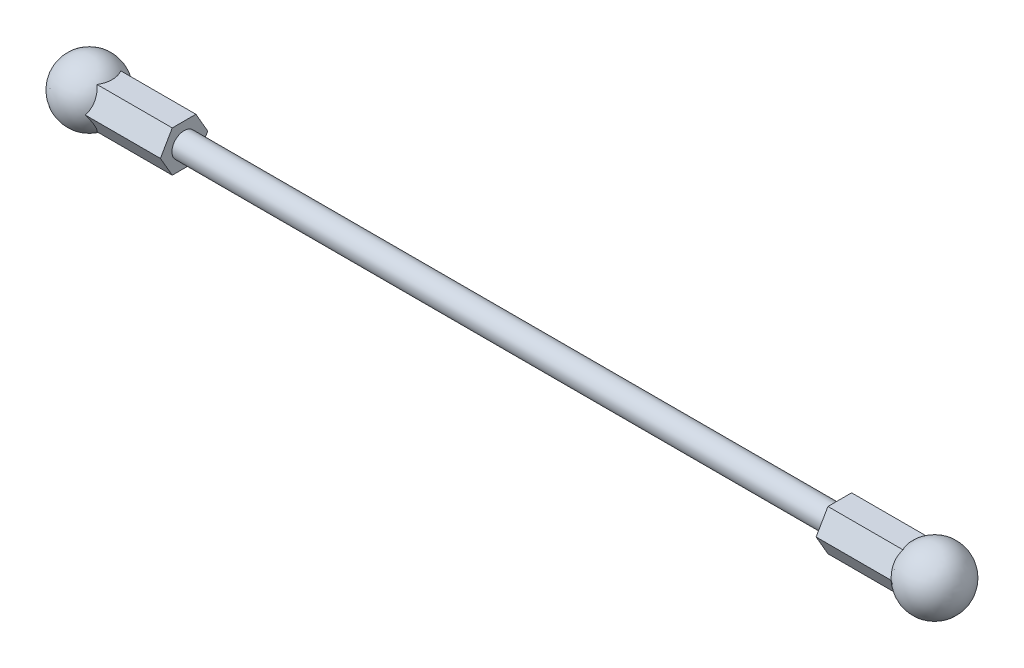
ISO-10303-21;
HEADER;
FILE_DESCRIPTION(('STEP AP214'),'2;1');
FILE_NAME('part.step','',(''),(''),'','','');
FILE_SCHEMA(('AUTOMOTIVE_DESIGN { 1 0 10303 214 1 1 1 1 }'));
ENDSEC;
DATA;
#1=APPLICATION_CONTEXT('core data for automotive mechanical design processes');
#2=APPLICATION_PROTOCOL_DEFINITION('international standard','automotive_design',2000,#1);
#3=PRODUCT_CONTEXT('',#1,'mechanical');
#4=PRODUCT('Part','Part','',(#3));
#5=PRODUCT_RELATED_PRODUCT_CATEGORY('part','',(#4));
#6=PRODUCT_DEFINITION_FORMATION('','',#4);
#7=PRODUCT_DEFINITION_CONTEXT('part definition',#1,'design');
#8=PRODUCT_DEFINITION('design','',#6,#7);
#9=PRODUCT_DEFINITION_SHAPE('','',#8);
#10=(LENGTH_UNIT() NAMED_UNIT(*) SI_UNIT(.MILLI.,.METRE.));
#11=(NAMED_UNIT(*) PLANE_ANGLE_UNIT() SI_UNIT($,.RADIAN.));
#12=(NAMED_UNIT(*) SI_UNIT($,.STERADIAN.) SOLID_ANGLE_UNIT());
#13=UNCERTAINTY_MEASURE_WITH_UNIT(LENGTH_MEASURE(1.E-05),#10,'distance_accuracy_value','');
#14=(GEOMETRIC_REPRESENTATION_CONTEXT(3) GLOBAL_UNCERTAINTY_ASSIGNED_CONTEXT((#13)) GLOBAL_UNIT_ASSIGNED_CONTEXT((#10,
#11,#12)) REPRESENTATION_CONTEXT('',''));
#15=CARTESIAN_POINT('',(0.,0.,0.));
#16=DIRECTION('',(0.,0.,1.));
#17=DIRECTION('',(1.,0.,0.));
#18=AXIS2_PLACEMENT_3D('',#15,#16,#17);
#19=CARTESIAN_POINT('',(73.25,2.,-1.15470053837925));
#20=DIRECTION('',(0.,-1.,0.));
#21=DIRECTION('',(0.,0.,-1.));
#22=AXIS2_PLACEMENT_3D('',#19,#20,#21);
#23=PLANE('',#22);
#24=DIRECTION('',(1.,0.,0.));
#25=VECTOR('',#24,1.);
#26=CARTESIAN_POINT('',(73.25,2.,-1.15470053837925));
#27=LINE('',#26,#25);
#28=CARTESIAN_POINT('',(73.25,2.,-1.15470053837925));
#29=VERTEX_POINT('',#28);
#30=CARTESIAN_POINT('',(80.5851457844873,2.,-1.15470053837925));
#31=VERTEX_POINT('',#30);
#32=EDGE_CURVE('E113',#29,#31,#27,.T.);
#33=ORIENTED_EDGE('',*,*,#32,.F.);
#34=DIRECTION('',(0.,0.,1.));
#35=VECTOR('',#34,1.);
#36=CARTESIAN_POINT('',(73.25,2.,-1.15470053837925));
#37=LINE('',#36,#35);
#38=CARTESIAN_POINT('',(73.25,2.,1.15470053837925));
#39=VERTEX_POINT('',#38);
#40=EDGE_CURVE('E103',#29,#39,#37,.T.);
#41=ORIENTED_EDGE('',*,*,#40,.T.);
#42=DIRECTION('',(1.,0.,0.));
#43=VECTOR('',#42,1.);
#44=CARTESIAN_POINT('',(73.25,2.,1.15470053837925));
#45=LINE('',#44,#43);
#46=CARTESIAN_POINT('',(80.5851457844873,2.,1.15470053837925));
#47=VERTEX_POINT('',#46);
#48=EDGE_CURVE('E67',#39,#47,#45,.T.);
#49=ORIENTED_EDGE('',*,*,#48,.T.);
#50=CARTESIAN_POINT('',(82.5,2.,0.));
#51=DIRECTION('',(0.,1.,0.));
#52=DIRECTION('',(0.,0.,-1.));
#53=AXIS2_PLACEMENT_3D('',#50,#51,#52);
#54=CIRCLE('',#53,2.23606797749979);
#55=EDGE_CURVE('E12',#31,#47,#54,.T.);
#56=ORIENTED_EDGE('',*,*,#55,.F.);
#57=EDGE_LOOP('',(#33,#41,#49,#56));
#58=FACE_BOUND('',#57,.T.);
#59=ADVANCED_FACE('F49',(#58),#23,.F.);
#60=CARTESIAN_POINT('',(73.25,2.,1.15470053837925));
#61=DIRECTION('',(0.,-0.5,-0.866025403784439));
#62=DIRECTION('',(0.,0.866025403784439,-0.5));
#63=AXIS2_PLACEMENT_3D('',#60,#61,#62);
#64=PLANE('',#63);
#65=ORIENTED_EDGE('',*,*,#48,.F.);
#66=DIRECTION('',(0.,-0.866025403784438,0.5));
#67=VECTOR('',#66,1.);
#68=CARTESIAN_POINT('',(73.25,2.,1.15470053837925));
#69=LINE('',#68,#67);
#70=CARTESIAN_POINT('',(73.25,0.,2.3094010767585));
#71=VERTEX_POINT('',#70);
#72=EDGE_CURVE('E101',#39,#71,#69,.T.);
#73=ORIENTED_EDGE('',*,*,#72,.T.);
#74=DIRECTION('',(1.,0.,0.));
#75=VECTOR('',#74,1.);
#76=CARTESIAN_POINT('',(73.25,0.,2.3094010767585));
#77=LINE('',#76,#75);
#78=CARTESIAN_POINT('',(80.5851457844873,0.,2.3094010767585));
#79=VERTEX_POINT('',#78);
#80=EDGE_CURVE('E141',#71,#79,#77,.T.);
#81=ORIENTED_EDGE('',*,*,#80,.T.);
#82=CARTESIAN_POINT('',(82.5,1.,1.73205080756888));
#83=DIRECTION('',(0.,0.5,0.866025403784439));
#84=DIRECTION('',(0.,0.866025403784439,-0.5));
#85=AXIS2_PLACEMENT_3D('',#82,#83,#84);
#86=CIRCLE('',#85,2.23606797749979);
#87=EDGE_CURVE('E57',#47,#79,#86,.T.);
#88=ORIENTED_EDGE('',*,*,#87,.F.);
#89=EDGE_LOOP('',(#65,#73,#81,#88));
#90=FACE_BOUND('',#89,.T.);
#91=ADVANCED_FACE('F109',(#90),#64,.F.);
#92=CARTESIAN_POINT('',(73.25,0.,2.3094010767585));
#93=DIRECTION('',(0.,0.5,-0.866025403784439));
#94=DIRECTION('',(0.,0.866025403784439,0.5));
#95=AXIS2_PLACEMENT_3D('',#92,#93,#94);
#96=PLANE('',#95);
#97=ORIENTED_EDGE('',*,*,#80,.F.);
#98=DIRECTION('',(0.,-0.866025403784439,-0.5));
#99=VECTOR('',#98,1.);
#100=CARTESIAN_POINT('',(73.25,0.,2.3094010767585));
#101=LINE('',#100,#99);
#102=CARTESIAN_POINT('',(73.25,-2.,1.15470053837925));
#103=VERTEX_POINT('',#102);
#104=EDGE_CURVE('E105',#71,#103,#101,.T.);
#105=ORIENTED_EDGE('',*,*,#104,.T.);
#106=DIRECTION('',(1.,0.,0.));
#107=VECTOR('',#106,1.);
#108=CARTESIAN_POINT('',(73.25,-2.,1.15470053837925));
#109=LINE('',#108,#107);
#110=CARTESIAN_POINT('',(80.5851457844873,-2.,1.15470053837925));
#111=VERTEX_POINT('',#110);
#112=EDGE_CURVE('E136',#103,#111,#109,.T.);
#113=ORIENTED_EDGE('',*,*,#112,.T.);
#114=CARTESIAN_POINT('',(82.5,-1.,1.73205080756888));
#115=DIRECTION('',(0.,-0.5,0.866025403784439));
#116=DIRECTION('',(0.,0.866025403784439,0.5));
#117=AXIS2_PLACEMENT_3D('',#114,#115,#116);
#118=CIRCLE('',#117,2.23606797749979);
#119=EDGE_CURVE('E111',#79,#111,#118,.T.);
#120=ORIENTED_EDGE('',*,*,#119,.F.);
#121=EDGE_LOOP('',(#97,#105,#113,#120));
#122=FACE_BOUND('',#121,.T.);
#123=ADVANCED_FACE('F159',(#122),#96,.F.);
#124=CARTESIAN_POINT('',(73.25,-2.,1.15470053837925));
#125=DIRECTION('',(0.,1.,0.));
#126=DIRECTION('',(0.,0.,1.));
#127=AXIS2_PLACEMENT_3D('',#124,#125,#126);
#128=PLANE('',#127);
#129=ORIENTED_EDGE('',*,*,#112,.F.);
#130=DIRECTION('',(0.,0.,-1.));
#131=VECTOR('',#130,1.);
#132=CARTESIAN_POINT('',(73.25,-2.,1.15470053837925));
#133=LINE('',#132,#131);
#134=CARTESIAN_POINT('',(73.25,-2.,-1.15470053837925));
#135=VERTEX_POINT('',#134);
#136=EDGE_CURVE('E120',#103,#135,#133,.T.);
#137=ORIENTED_EDGE('',*,*,#136,.T.);
#138=DIRECTION('',(1.,0.,0.));
#139=VECTOR('',#138,1.);
#140=CARTESIAN_POINT('',(73.25,-2.,-1.15470053837925));
#141=LINE('',#140,#139);
#142=CARTESIAN_POINT('',(80.5851457844873,-2.,-1.15470053837925));
#143=VERTEX_POINT('',#142);
#144=EDGE_CURVE('E131',#135,#143,#141,.T.);
#145=ORIENTED_EDGE('',*,*,#144,.T.);
#146=CARTESIAN_POINT('',(82.5,-2.,0.));
#147=DIRECTION('',(0.,-1.,0.));
#148=DIRECTION('',(0.,0.,1.));
#149=AXIS2_PLACEMENT_3D('',#146,#147,#148);
#150=CIRCLE('',#149,2.23606797749979);
#151=EDGE_CURVE('E138',#111,#143,#150,.T.);
#152=ORIENTED_EDGE('',*,*,#151,.F.);
#153=EDGE_LOOP('',(#129,#137,#145,#152));
#154=FACE_BOUND('',#153,.T.);
#155=ADVANCED_FACE('F157',(#154),#128,.F.);
#156=CARTESIAN_POINT('',(73.25,-2.,-1.15470053837925));
#157=DIRECTION('',(0.,0.5,0.866025403784439));
#158=DIRECTION('',(0.,-0.866025403784439,0.5));
#159=AXIS2_PLACEMENT_3D('',#156,#157,#158);
#160=PLANE('',#159);
#161=ORIENTED_EDGE('',*,*,#144,.F.);
#162=DIRECTION('',(0.,0.866025403784438,-0.5));
#163=VECTOR('',#162,1.);
#164=CARTESIAN_POINT('',(73.25,-2.,-1.15470053837925));
#165=LINE('',#164,#163);
#166=CARTESIAN_POINT('',(73.25,0.,-2.3094010767585));
#167=VERTEX_POINT('',#166);
#168=EDGE_CURVE('E123',#135,#167,#165,.T.);
#169=ORIENTED_EDGE('',*,*,#168,.T.);
#170=DIRECTION('',(1.,0.,0.));
#171=VECTOR('',#170,1.);
#172=CARTESIAN_POINT('',(73.25,0.,-2.3094010767585));
#173=LINE('',#172,#171);
#174=CARTESIAN_POINT('',(80.5851457844873,0.,-2.3094010767585));
#175=VERTEX_POINT('',#174);
#176=EDGE_CURVE('E128',#167,#175,#173,.T.);
#177=ORIENTED_EDGE('',*,*,#176,.T.);
#178=CARTESIAN_POINT('',(82.5,-1.,-1.73205080756888));
#179=DIRECTION('',(0.,-0.5,-0.866025403784439));
#180=DIRECTION('',(0.,-0.866025403784439,0.5));
#181=AXIS2_PLACEMENT_3D('',#178,#179,#180);
#182=CIRCLE('',#181,2.23606797749979);
#183=EDGE_CURVE('E133',#143,#175,#182,.T.);
#184=ORIENTED_EDGE('',*,*,#183,.F.);
#185=EDGE_LOOP('',(#161,#169,#177,#184));
#186=FACE_BOUND('',#185,.T.);
#187=ADVANCED_FACE('F154',(#186),#160,.F.);
#188=CARTESIAN_POINT('',(73.25,0.,-2.3094010767585));
#189=DIRECTION('',(0.,-0.5,0.866025403784439));
#190=DIRECTION('',(0.,-0.866025403784439,-0.5));
#191=AXIS2_PLACEMENT_3D('',#188,#189,#190);
#192=PLANE('',#191);
#193=ORIENTED_EDGE('',*,*,#176,.F.);
#194=DIRECTION('',(0.,0.866025403784439,0.5));
#195=VECTOR('',#194,1.);
#196=CARTESIAN_POINT('',(73.25,0.,-2.3094010767585));
#197=LINE('',#196,#195);
#198=EDGE_CURVE('E126',#167,#29,#197,.T.);
#199=ORIENTED_EDGE('',*,*,#198,.T.);
#200=ORIENTED_EDGE('',*,*,#32,.T.);
#201=CARTESIAN_POINT('',(82.5,1.,-1.73205080756888));
#202=DIRECTION('',(0.,0.5,-0.866025403784439));
#203=DIRECTION('',(0.,-0.866025403784439,-0.5));
#204=AXIS2_PLACEMENT_3D('',#201,#202,#203);
#205=CIRCLE('',#204,2.23606797749979);
#206=EDGE_CURVE('E114',#175,#31,#205,.T.);
#207=ORIENTED_EDGE('',*,*,#206,.F.);
#208=EDGE_LOOP('',(#193,#199,#200,#207));
#209=FACE_BOUND('',#208,.T.);
#210=ADVANCED_FACE('F150',(#209),#192,.F.);
#211=CARTESIAN_POINT('',(73.25,0.,0.));
#212=DIRECTION('',(-1.,0.,0.));
#213=DIRECTION('',(0.,0.,-1.));
#214=AXIS2_PLACEMENT_3D('',#211,#212,#213);
#215=PLANE('',#214);
#216=ORIENTED_EDGE('',*,*,#40,.F.);
#217=ORIENTED_EDGE('',*,*,#198,.F.);
#218=ORIENTED_EDGE('',*,*,#168,.F.);
#219=ORIENTED_EDGE('',*,*,#136,.F.);
#220=ORIENTED_EDGE('',*,*,#104,.F.);
#221=ORIENTED_EDGE('',*,*,#72,.F.);
#222=EDGE_LOOP('',(#216,#217,#218,#219,#220,#221));
#223=FACE_BOUND('',#222,.T.);
#224=ADVANCED_FACE('F102',(#223),#215,.T.);
#225=CARTESIAN_POINT('',(82.5,0.,0.));
#226=DIRECTION('',(0.,1.,0.));
#227=DIRECTION('',(0.,0.,-1.));
#228=AXIS2_PLACEMENT_3D('',#225,#226,#227);
#229=SPHERICAL_SURFACE('',#228,3.);
#230=ORIENTED_EDGE('',*,*,#206,.T.);
#231=ORIENTED_EDGE('',*,*,#55,.T.);
#232=ORIENTED_EDGE('',*,*,#87,.T.);
#233=ORIENTED_EDGE('',*,*,#119,.T.);
#234=ORIENTED_EDGE('',*,*,#151,.T.);
#235=ORIENTED_EDGE('',*,*,#183,.T.);
#236=EDGE_LOOP('',(#230,#231,#232,#233,#234,#235));
#237=FACE_BOUND('',#236,.T.);
#238=ADVANCED_FACE('F51',(#237),#229,.T.);
#239=CLOSED_SHELL('',(#59,#91,#123,#155,#187,#210,#224,#238));
#240=MANIFOLD_SOLID_BREP('B2',#239);
#241=CARTESIAN_POINT('',(0.,0.,0.));
#242=DIRECTION('',(0.,1.,0.));
#243=DIRECTION('',(-1.,0.,0.));
#244=AXIS2_PLACEMENT_3D('',#241,#242,#243);
#245=SPHERICAL_SURFACE('',#244,3.);
#246=CARTESIAN_POINT('',(0.,2.,0.));
#247=DIRECTION('',(0.,-1.,0.));
#248=DIRECTION('',(0.,0.,-1.));
#249=AXIS2_PLACEMENT_3D('',#246,#247,#248);
#250=CIRCLE('',#249,2.23606797749979);
#251=CARTESIAN_POINT('',(1.91485421551268,2.,-1.15470053837925));
#252=VERTEX_POINT('',#251);
#253=CARTESIAN_POINT('',(1.91485421551268,2.,1.15470053837925));
#254=VERTEX_POINT('',#253);
#255=EDGE_CURVE('E47',#252,#254,#250,.T.);
#256=ORIENTED_EDGE('',*,*,#255,.F.);
#257=CARTESIAN_POINT('',(0.,1.,-1.73205080756888));
#258=DIRECTION('',(0.,-0.5,0.866025403784439));
#259=DIRECTION('',(0.,-0.866025403784439,-0.5));
#260=AXIS2_PLACEMENT_3D('',#257,#258,#259);
#261=CIRCLE('',#260,2.23606797749979);
#262=CARTESIAN_POINT('',(1.91485421551268,0.,-2.3094010767585));
#263=VERTEX_POINT('',#262);
#264=EDGE_CURVE('E295',#263,#252,#261,.T.);
#265=ORIENTED_EDGE('',*,*,#264,.F.);
#266=CARTESIAN_POINT('',(0.,-1.,-1.73205080756888));
#267=DIRECTION('',(0.,0.5,0.866025403784439));
#268=DIRECTION('',(0.,-0.866025403784439,0.5));
#269=AXIS2_PLACEMENT_3D('',#266,#267,#268);
#270=CIRCLE('',#269,2.23606797749979);
#271=CARTESIAN_POINT('',(1.91485421551268,-2.,-1.15470053837925));
#272=VERTEX_POINT('',#271);
#273=EDGE_CURVE('E298',#272,#263,#270,.T.);
#274=ORIENTED_EDGE('',*,*,#273,.F.);
#275=CARTESIAN_POINT('',(0.,-2.,0.));
#276=DIRECTION('',(0.,1.,0.));
#277=DIRECTION('',(0.,0.,1.));
#278=AXIS2_PLACEMENT_3D('',#275,#276,#277);
#279=CIRCLE('',#278,2.23606797749979);
#280=CARTESIAN_POINT('',(1.91485421551268,-2.,1.15470053837925));
#281=VERTEX_POINT('',#280);
#282=EDGE_CURVE('E306',#281,#272,#279,.T.);
#283=ORIENTED_EDGE('',*,*,#282,.F.);
#284=CARTESIAN_POINT('',(0.,-1.,1.73205080756888));
#285=DIRECTION('',(0.,0.5,-0.866025403784439));
#286=DIRECTION('',(0.,0.866025403784439,0.5));
#287=AXIS2_PLACEMENT_3D('',#284,#285,#286);
#288=CIRCLE('',#287,2.23606797749979);
#289=CARTESIAN_POINT('',(1.91485421551268,0.,2.3094010767585));
#290=VERTEX_POINT('',#289);
#291=EDGE_CURVE('E242',#290,#281,#288,.T.);
#292=ORIENTED_EDGE('',*,*,#291,.F.);
#293=CARTESIAN_POINT('',(0.,1.,1.73205080756888));
#294=DIRECTION('',(0.,-0.5,-0.866025403784439));
#295=DIRECTION('',(0.,0.866025403784439,-0.5));
#296=AXIS2_PLACEMENT_3D('',#293,#294,#295);
#297=CIRCLE('',#296,2.23606797749979);
#298=EDGE_CURVE('E232',#254,#290,#297,.T.);
#299=ORIENTED_EDGE('',*,*,#298,.F.);
#300=EDGE_LOOP('',(#256,#265,#274,#283,#292,#299));
#301=FACE_BOUND('',#300,.T.);
#302=ADVANCED_FACE('F225',(#301),#245,.T.);
#303=CARTESIAN_POINT('',(9.25,2.,-1.15470053837925));
#304=DIRECTION('',(0.,-1.,0.));
#305=DIRECTION('',(0.,0.,-1.));
#306=AXIS2_PLACEMENT_3D('',#303,#304,#305);
#307=PLANE('',#306);
#308=DIRECTION('',(-1.,0.,0.));
#309=VECTOR('',#308,1.);
#310=CARTESIAN_POINT('',(9.25,2.,-1.15470053837925));
#311=LINE('',#310,#309);
#312=CARTESIAN_POINT('',(9.25,2.,-1.15470053837925));
#313=VERTEX_POINT('',#312);
#314=EDGE_CURVE('E321',#313,#252,#311,.T.);
#315=ORIENTED_EDGE('',*,*,#314,.T.);
#316=ORIENTED_EDGE('',*,*,#255,.T.);
#317=DIRECTION('',(-1.,0.,0.));
#318=VECTOR('',#317,1.);
#319=CARTESIAN_POINT('',(9.25,2.,1.15470053837925));
#320=LINE('',#319,#318);
#321=CARTESIAN_POINT('',(9.25,2.,1.15470053837925));
#322=VERTEX_POINT('',#321);
#323=EDGE_CURVE('E277',#322,#254,#320,.T.);
#324=ORIENTED_EDGE('',*,*,#323,.F.);
#325=DIRECTION('',(0.,0.,1.));
#326=VECTOR('',#325,1.);
#327=CARTESIAN_POINT('',(9.25,2.,-1.15470053837925));
#328=LINE('',#327,#326);
#329=EDGE_CURVE('E283',#313,#322,#328,.T.);
#330=ORIENTED_EDGE('',*,*,#329,.F.);
#331=EDGE_LOOP('',(#315,#316,#324,#330));
#332=FACE_BOUND('',#331,.T.);
#333=ADVANCED_FACE('F294',(#332),#307,.F.);
#334=CARTESIAN_POINT('',(9.25,2.,1.15470053837925));
#335=DIRECTION('',(0.,-0.5,-0.866025403784439));
#336=DIRECTION('',(0.,0.866025403784439,-0.5));
#337=AXIS2_PLACEMENT_3D('',#334,#335,#336);
#338=PLANE('',#337);
#339=ORIENTED_EDGE('',*,*,#323,.T.);
#340=ORIENTED_EDGE('',*,*,#298,.T.);
#341=DIRECTION('',(-1.,0.,0.));
#342=VECTOR('',#341,1.);
#343=CARTESIAN_POINT('',(9.25,0.,2.3094010767585));
#344=LINE('',#343,#342);
#345=CARTESIAN_POINT('',(9.25,0.,2.3094010767585));
#346=VERTEX_POINT('',#345);
#347=EDGE_CURVE('E279',#346,#290,#344,.T.);
#348=ORIENTED_EDGE('',*,*,#347,.F.);
#349=DIRECTION('',(0.,-0.866025403784438,0.5));
#350=VECTOR('',#349,1.);
#351=CARTESIAN_POINT('',(9.25,2.,1.15470053837925));
#352=LINE('',#351,#350);
#353=EDGE_CURVE('E273',#322,#346,#352,.T.);
#354=ORIENTED_EDGE('',*,*,#353,.F.);
#355=EDGE_LOOP('',(#339,#340,#348,#354));
#356=FACE_BOUND('',#355,.T.);
#357=ADVANCED_FACE('F275',(#356),#338,.F.);
#358=CARTESIAN_POINT('',(9.25,0.,2.3094010767585));
#359=DIRECTION('',(0.,0.5,-0.866025403784439));
#360=DIRECTION('',(0.,0.866025403784439,0.5));
#361=AXIS2_PLACEMENT_3D('',#358,#359,#360);
#362=PLANE('',#361);
#363=ORIENTED_EDGE('',*,*,#347,.T.);
#364=ORIENTED_EDGE('',*,*,#291,.T.);
#365=DIRECTION('',(-1.,0.,0.));
#366=VECTOR('',#365,1.);
#367=CARTESIAN_POINT('',(9.25,-2.,1.15470053837925));
#368=LINE('',#367,#366);
#369=CARTESIAN_POINT('',(9.25,-2.,1.15470053837925));
#370=VERTEX_POINT('',#369);
#371=EDGE_CURVE('E300',#370,#281,#368,.T.);
#372=ORIENTED_EDGE('',*,*,#371,.F.);
#373=DIRECTION('',(0.,-0.866025403784439,-0.5));
#374=VECTOR('',#373,1.);
#375=CARTESIAN_POINT('',(9.25,0.,2.3094010767585));
#376=LINE('',#375,#374);
#377=EDGE_CURVE('E282',#346,#370,#376,.T.);
#378=ORIENTED_EDGE('',*,*,#377,.F.);
#379=EDGE_LOOP('',(#363,#364,#372,#378));
#380=FACE_BOUND('',#379,.T.);
#381=ADVANCED_FACE('F310',(#380),#362,.F.);
#382=CARTESIAN_POINT('',(9.25,-2.,1.15470053837925));
#383=DIRECTION('',(0.,1.,0.));
#384=DIRECTION('',(0.,0.,1.));
#385=AXIS2_PLACEMENT_3D('',#382,#383,#384);
#386=PLANE('',#385);
#387=ORIENTED_EDGE('',*,*,#371,.T.);
#388=ORIENTED_EDGE('',*,*,#282,.T.);
#389=DIRECTION('',(-1.,0.,0.));
#390=VECTOR('',#389,1.);
#391=CARTESIAN_POINT('',(9.25,-2.,-1.15470053837925));
#392=LINE('',#391,#390);
#393=CARTESIAN_POINT('',(9.25,-2.,-1.15470053837925));
#394=VERTEX_POINT('',#393);
#395=EDGE_CURVE('E326',#394,#272,#392,.T.);
#396=ORIENTED_EDGE('',*,*,#395,.F.);
#397=DIRECTION('',(0.,0.,-1.));
#398=VECTOR('',#397,1.);
#399=CARTESIAN_POINT('',(9.25,-2.,1.15470053837925));
#400=LINE('',#399,#398);
#401=EDGE_CURVE('E314',#370,#394,#400,.T.);
#402=ORIENTED_EDGE('',*,*,#401,.F.);
#403=EDGE_LOOP('',(#387,#388,#396,#402));
#404=FACE_BOUND('',#403,.T.);
#405=ADVANCED_FACE('F329',(#404),#386,.F.);
#406=CARTESIAN_POINT('',(9.25,-2.,-1.15470053837925));
#407=DIRECTION('',(0.,0.5,0.866025403784439));
#408=DIRECTION('',(0.,-0.866025403784439,0.5));
#409=AXIS2_PLACEMENT_3D('',#406,#407,#408);
#410=PLANE('',#409);
#411=ORIENTED_EDGE('',*,*,#395,.T.);
#412=ORIENTED_EDGE('',*,*,#273,.T.);
#413=DIRECTION('',(-1.,0.,0.));
#414=VECTOR('',#413,1.);
#415=CARTESIAN_POINT('',(9.25,0.,-2.3094010767585));
#416=LINE('',#415,#414);
#417=CARTESIAN_POINT('',(9.25,0.,-2.3094010767585));
#418=VERTEX_POINT('',#417);
#419=EDGE_CURVE('E323',#418,#263,#416,.T.);
#420=ORIENTED_EDGE('',*,*,#419,.F.);
#421=DIRECTION('',(0.,0.866025403784438,-0.5));
#422=VECTOR('',#421,1.);
#423=CARTESIAN_POINT('',(9.25,-2.,-1.15470053837925));
#424=LINE('',#423,#422);
#425=EDGE_CURVE('E316',#394,#418,#424,.T.);
#426=ORIENTED_EDGE('',*,*,#425,.F.);
#427=EDGE_LOOP('',(#411,#412,#420,#426));
#428=FACE_BOUND('',#427,.T.);
#429=ADVANCED_FACE('F334',(#428),#410,.F.);
#430=CARTESIAN_POINT('',(9.25,0.,-2.3094010767585));
#431=DIRECTION('',(0.,-0.5,0.866025403784439));
#432=DIRECTION('',(0.,-0.866025403784439,-0.5));
#433=AXIS2_PLACEMENT_3D('',#430,#431,#432);
#434=PLANE('',#433);
#435=ORIENTED_EDGE('',*,*,#419,.T.);
#436=ORIENTED_EDGE('',*,*,#264,.T.);
#437=ORIENTED_EDGE('',*,*,#314,.F.);
#438=DIRECTION('',(0.,0.866025403784439,0.5));
#439=VECTOR('',#438,1.);
#440=CARTESIAN_POINT('',(9.25,0.,-2.3094010767585));
#441=LINE('',#440,#439);
#442=EDGE_CURVE('E288',#418,#313,#441,.T.);
#443=ORIENTED_EDGE('',*,*,#442,.F.);
#444=EDGE_LOOP('',(#435,#436,#437,#443));
#445=FACE_BOUND('',#444,.T.);
#446=ADVANCED_FACE('F336',(#445),#434,.F.);
#447=CARTESIAN_POINT('',(9.25,0.,0.));
#448=DIRECTION('',(1.,0.,0.));
#449=DIRECTION('',(0.,0.,-1.));
#450=AXIS2_PLACEMENT_3D('',#447,#448,#449);
#451=PLANE('',#450);
#452=CARTESIAN_POINT('',(9.25,0.,-0.00793613059507685));
#453=DIRECTION('',(1.,0.,0.));
#454=DIRECTION('',(0.,0.,-1.));
#455=AXIS2_PLACEMENT_3D('',#452,#453,#454);
#456=CIRCLE('',#455,1.190625);
#457=CARTESIAN_POINT('',(9.25,0.,-1.19856113059508));
#458=VERTEX_POINT('',#457);
#459=EDGE_CURVE('E368',#458,#458,#456,.T.);
#460=ORIENTED_EDGE('',*,*,#459,.F.);
#461=EDGE_LOOP('',(#460));
#462=FACE_BOUND('',#461,.T.);
#463=ORIENTED_EDGE('',*,*,#329,.T.);
#464=ORIENTED_EDGE('',*,*,#353,.T.);
#465=ORIENTED_EDGE('',*,*,#377,.T.);
#466=ORIENTED_EDGE('',*,*,#401,.T.);
#467=ORIENTED_EDGE('',*,*,#425,.T.);
#468=ORIENTED_EDGE('',*,*,#442,.T.);
#469=EDGE_LOOP('',(#463,#464,#465,#466,#467,#468));
#470=FACE_BOUND('',#469,.T.);
#471=ADVANCED_FACE('F286',(#462,#470),#451,.T.);
#472=CARTESIAN_POINT('',(76.6175960454009,0.,-0.00793613059507685));
#473=DIRECTION('',(-1.,0.,0.));
#474=DIRECTION('',(0.,0.,1.));
#475=AXIS2_PLACEMENT_3D('',#472,#473,#474);
#476=CYLINDRICAL_SURFACE('',#475,1.190625);
#477=CARTESIAN_POINT('',(73.25,0.,-0.00793613059507685));
#478=DIRECTION('',(-1.,0.,0.));
#479=DIRECTION('',(0.,0.,1.));
#480=AXIS2_PLACEMENT_3D('',#477,#478,#479);
#481=CIRCLE('',#480,1.190625);
#482=CARTESIAN_POINT('',(73.25,0.,1.18268886940492));
#483=VERTEX_POINT('',#482);
#484=EDGE_CURVE('E292',#483,#483,#481,.T.);
#485=ORIENTED_EDGE('',*,*,#484,.T.);
#486=EDGE_LOOP('',(#485));
#487=FACE_BOUND('',#486,.T.);
#488=ORIENTED_EDGE('',*,*,#459,.T.);
#489=EDGE_LOOP('',(#488));
#490=FACE_BOUND('',#489,.T.);
#491=ADVANCED_FACE('F356',(#487,#490),#476,.T.);
#492=CARTESIAN_POINT('',(73.25,0.,0.));
#493=DIRECTION('',(-1.,0.,0.));
#494=DIRECTION('',(0.,0.,-1.));
#495=AXIS2_PLACEMENT_3D('',#492,#493,#494);
#496=PLANE('',#495);
#497=ORIENTED_EDGE('',*,*,#484,.F.);
#498=EDGE_LOOP('',(#497));
#499=FACE_BOUND('',#498,.T.);
#500=ADVANCED_FACE('F360',(#499),#496,.F.);
#501=CLOSED_SHELL('',(#302,#333,#357,#381,#405,#429,#446,#471,#491,#500));
#502=MANIFOLD_SOLID_BREP('B6',#501);
#503=ADVANCED_BREP_SHAPE_REPRESENTATION('',(#18,#240,#502),#14);
#504=SHAPE_DEFINITION_REPRESENTATION(#9,#503);
ENDSEC;
END-ISO-10303-21;
